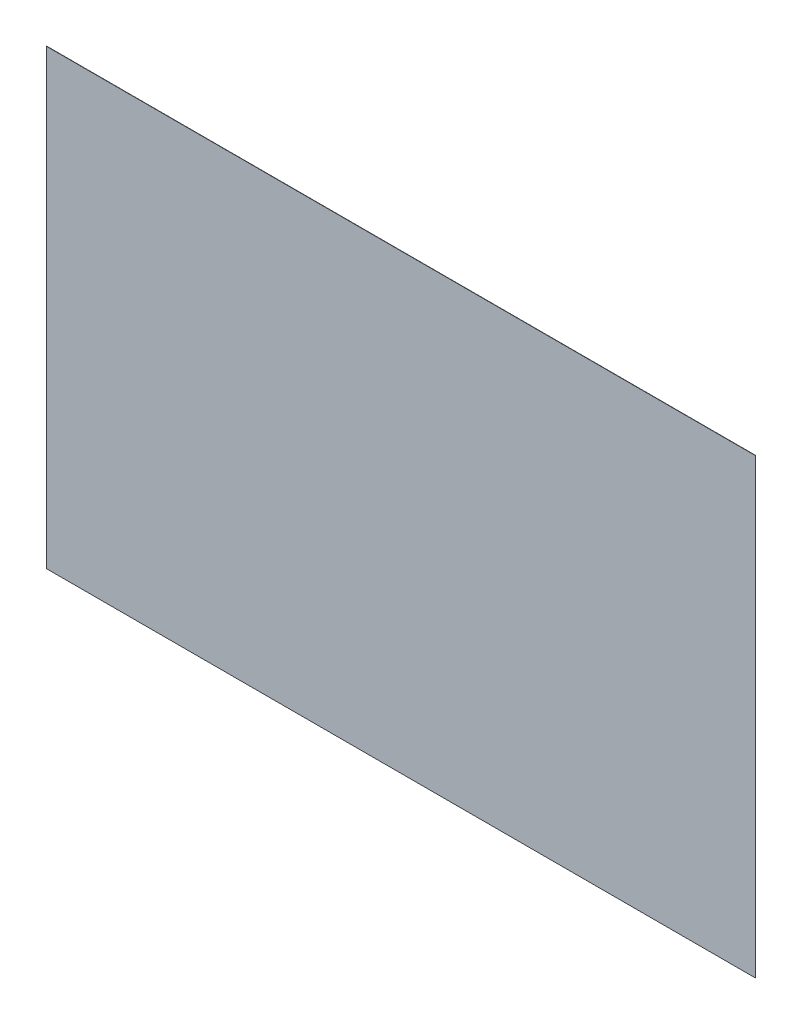
ISO-10303-21;
HEADER;
FILE_DESCRIPTION(('STEP AP214'),'2;1');
FILE_NAME('part.step','',(''),(''),'','','');
FILE_SCHEMA(('AUTOMOTIVE_DESIGN { 1 0 10303 214 1 1 1 1 }'));
ENDSEC;
DATA;
#1=APPLICATION_CONTEXT('core data for automotive mechanical design processes');
#2=APPLICATION_PROTOCOL_DEFINITION('international standard','automotive_design',2000,#1);
#3=PRODUCT_CONTEXT('',#1,'mechanical');
#4=PRODUCT('Part','Part','',(#3));
#5=PRODUCT_RELATED_PRODUCT_CATEGORY('part','',(#4));
#6=PRODUCT_DEFINITION_FORMATION('','',#4);
#7=PRODUCT_DEFINITION_CONTEXT('part definition',#1,'design');
#8=PRODUCT_DEFINITION('design','',#6,#7);
#9=PRODUCT_DEFINITION_SHAPE('','',#8);
#10=(LENGTH_UNIT() NAMED_UNIT(*) SI_UNIT(.MILLI.,.METRE.));
#11=(NAMED_UNIT(*) PLANE_ANGLE_UNIT() SI_UNIT($,.RADIAN.));
#12=(NAMED_UNIT(*) SI_UNIT($,.STERADIAN.) SOLID_ANGLE_UNIT());
#13=UNCERTAINTY_MEASURE_WITH_UNIT(LENGTH_MEASURE(1.E-05),#10,'distance_accuracy_value','');
#14=(GEOMETRIC_REPRESENTATION_CONTEXT(3) GLOBAL_UNCERTAINTY_ASSIGNED_CONTEXT((#13)) GLOBAL_UNIT_ASSIGNED_CONTEXT((#10,
#11,#12)) REPRESENTATION_CONTEXT('',''));
#15=CARTESIAN_POINT('',(0.,0.,0.));
#16=DIRECTION('',(0.,0.,1.));
#17=DIRECTION('',(1.,0.,0.));
#18=AXIS2_PLACEMENT_3D('',#15,#16,#17);
#19=CARTESIAN_POINT('',(0.,0.,1.));
#20=DIRECTION('',(1.,0.,0.));
#21=DIRECTION('',(0.,1.,0.));
#22=AXIS2_PLACEMENT_3D('',#19,#20,#21);
#23=PLANE('',#22);
#24=DIRECTION('',(0.,-1.,0.));
#25=VECTOR('',#24,1.);
#26=CARTESIAN_POINT('',(0.,0.,0.));
#27=LINE('',#26,#25);
#28=CARTESIAN_POINT('',(-4.44089209850063E-13,1595.,0.));
#29=VERTEX_POINT('',#28);
#30=CARTESIAN_POINT('',(0.,0.,0.));
#31=VERTEX_POINT('',#30);
#32=EDGE_CURVE('E107',#29,#31,#27,.T.);
#33=ORIENTED_EDGE('',*,*,#32,.T.);
#34=DIRECTION('',(0.,0.,-1.));
#35=VECTOR('',#34,1.);
#36=CARTESIAN_POINT('',(0.,0.,1.));
#37=LINE('',#36,#35);
#38=CARTESIAN_POINT('',(0.,0.,1.));
#39=VERTEX_POINT('',#38);
#40=EDGE_CURVE('E11',#39,#31,#37,.T.);
#41=ORIENTED_EDGE('',*,*,#40,.F.);
#42=DIRECTION('',(0.,-1.,0.));
#43=VECTOR('',#42,1.);
#44=CARTESIAN_POINT('',(0.,0.,1.));
#45=LINE('',#44,#43);
#46=CARTESIAN_POINT('',(-4.44089209850063E-13,1595.,1.));
#47=VERTEX_POINT('',#46);
#48=EDGE_CURVE('E91',#47,#39,#45,.T.);
#49=ORIENTED_EDGE('',*,*,#48,.F.);
#50=DIRECTION('',(0.,0.,-1.));
#51=VECTOR('',#50,1.);
#52=CARTESIAN_POINT('',(-4.44089209850063E-13,1595.,1.));
#53=LINE('',#52,#51);
#54=EDGE_CURVE('E103',#47,#29,#53,.T.);
#55=ORIENTED_EDGE('',*,*,#54,.T.);
#56=EDGE_LOOP('',(#33,#41,#49,#55));
#57=FACE_BOUND('',#56,.T.);
#58=ADVANCED_FACE('F39',(#57),#23,.F.);
#59=CARTESIAN_POINT('',(0.,0.,1.));
#60=DIRECTION('',(0.,1.,0.));
#61=DIRECTION('',(0.,0.,1.));
#62=AXIS2_PLACEMENT_3D('',#59,#60,#61);
#63=PLANE('',#62);
#64=DIRECTION('',(1.,0.,0.));
#65=VECTOR('',#64,1.);
#66=CARTESIAN_POINT('',(0.,0.,0.));
#67=LINE('',#66,#65);
#68=CARTESIAN_POINT('',(2500.,0.,0.));
#69=VERTEX_POINT('',#68);
#70=EDGE_CURVE('E96',#31,#69,#67,.T.);
#71=ORIENTED_EDGE('',*,*,#70,.T.);
#72=DIRECTION('',(0.,0.,-1.));
#73=VECTOR('',#72,1.);
#74=CARTESIAN_POINT('',(2500.,0.,1.));
#75=LINE('',#74,#73);
#76=CARTESIAN_POINT('',(2500.,0.,1.));
#77=VERTEX_POINT('',#76);
#78=EDGE_CURVE('E48',#77,#69,#75,.T.);
#79=ORIENTED_EDGE('',*,*,#78,.F.);
#80=DIRECTION('',(1.,0.,0.));
#81=VECTOR('',#80,1.);
#82=CARTESIAN_POINT('',(0.,0.,1.));
#83=LINE('',#82,#81);
#84=EDGE_CURVE('E86',#39,#77,#83,.T.);
#85=ORIENTED_EDGE('',*,*,#84,.F.);
#86=ORIENTED_EDGE('',*,*,#40,.T.);
#87=EDGE_LOOP('',(#71,#79,#85,#86));
#88=FACE_BOUND('',#87,.T.);
#89=ADVANCED_FACE('F95',(#88),#63,.F.);
#90=CARTESIAN_POINT('',(2500.,0.,1.));
#91=DIRECTION('',(-1.,0.,0.));
#92=DIRECTION('',(0.,-1.,0.));
#93=AXIS2_PLACEMENT_3D('',#90,#91,#92);
#94=PLANE('',#93);
#95=DIRECTION('',(0.,1.,0.));
#96=VECTOR('',#95,1.);
#97=CARTESIAN_POINT('',(2500.,0.,0.));
#98=LINE('',#97,#96);
#99=CARTESIAN_POINT('',(2500.,1595.,0.));
#100=VERTEX_POINT('',#99);
#101=EDGE_CURVE('E73',#69,#100,#98,.T.);
#102=ORIENTED_EDGE('',*,*,#101,.T.);
#103=DIRECTION('',(0.,0.,-1.));
#104=VECTOR('',#103,1.);
#105=CARTESIAN_POINT('',(2500.,1595.,1.));
#106=LINE('',#105,#104);
#107=CARTESIAN_POINT('',(2500.,1595.,1.));
#108=VERTEX_POINT('',#107);
#109=EDGE_CURVE('E98',#108,#100,#106,.T.);
#110=ORIENTED_EDGE('',*,*,#109,.F.);
#111=DIRECTION('',(0.,1.,0.));
#112=VECTOR('',#111,1.);
#113=CARTESIAN_POINT('',(2500.,0.,1.));
#114=LINE('',#113,#112);
#115=EDGE_CURVE('E89',#77,#108,#114,.T.);
#116=ORIENTED_EDGE('',*,*,#115,.F.);
#117=ORIENTED_EDGE('',*,*,#78,.T.);
#118=EDGE_LOOP('',(#102,#110,#116,#117));
#119=FACE_BOUND('',#118,.T.);
#120=ADVANCED_FACE('F99',(#119),#94,.F.);
#121=CARTESIAN_POINT('',(-4.44089209850063E-13,1595.,1.));
#122=DIRECTION('',(0.,-1.,0.));
#123=DIRECTION('',(0.,0.,-1.));
#124=AXIS2_PLACEMENT_3D('',#121,#122,#123);
#125=PLANE('',#124);
#126=DIRECTION('',(-1.,0.,0.));
#127=VECTOR('',#126,1.);
#128=CARTESIAN_POINT('',(-4.44089209850063E-13,1595.,0.));
#129=LINE('',#128,#127);
#130=EDGE_CURVE('E79',#100,#29,#129,.T.);
#131=ORIENTED_EDGE('',*,*,#130,.T.);
#132=ORIENTED_EDGE('',*,*,#54,.F.);
#133=DIRECTION('',(-1.,0.,0.));
#134=VECTOR('',#133,1.);
#135=CARTESIAN_POINT('',(-4.44089209850063E-13,1595.,1.));
#136=LINE('',#135,#134);
#137=EDGE_CURVE('E56',#108,#47,#136,.T.);
#138=ORIENTED_EDGE('',*,*,#137,.F.);
#139=ORIENTED_EDGE('',*,*,#109,.T.);
#140=EDGE_LOOP('',(#131,#132,#138,#139));
#141=FACE_BOUND('',#140,.T.);
#142=ADVANCED_FACE('F120',(#141),#125,.F.);
#143=CARTESIAN_POINT('',(0.,0.,1.));
#144=DIRECTION('',(0.,0.,-1.));
#145=DIRECTION('',(-1.,0.,0.));
#146=AXIS2_PLACEMENT_3D('',#143,#144,#145);
#147=PLANE('',#146);
#148=ORIENTED_EDGE('',*,*,#48,.T.);
#149=ORIENTED_EDGE('',*,*,#84,.T.);
#150=ORIENTED_EDGE('',*,*,#115,.T.);
#151=ORIENTED_EDGE('',*,*,#137,.T.);
#152=EDGE_LOOP('',(#148,#149,#150,#151));
#153=FACE_BOUND('',#152,.T.);
#154=ADVANCED_FACE('F87',(#153),#147,.F.);
#155=CARTESIAN_POINT('',(0.,0.,0.));
#156=DIRECTION('',(0.,0.,-1.));
#157=DIRECTION('',(-1.,0.,0.));
#158=AXIS2_PLACEMENT_3D('',#155,#156,#157);
#159=PLANE('',#158);
#160=ORIENTED_EDGE('',*,*,#32,.F.);
#161=ORIENTED_EDGE('',*,*,#130,.F.);
#162=ORIENTED_EDGE('',*,*,#101,.F.);
#163=ORIENTED_EDGE('',*,*,#70,.F.);
#164=EDGE_LOOP('',(#160,#161,#162,#163));
#165=FACE_BOUND('',#164,.T.);
#166=ADVANCED_FACE('F123',(#165),#159,.T.);
#167=CLOSED_SHELL('',(#58,#89,#120,#142,#154,#166));
#168=MANIFOLD_SOLID_BREP('B2',#167);
#169=ADVANCED_BREP_SHAPE_REPRESENTATION('',(#18,#168),#14);
#170=SHAPE_DEFINITION_REPRESENTATION(#9,#169);
ENDSEC;
END-ISO-10303-21;
